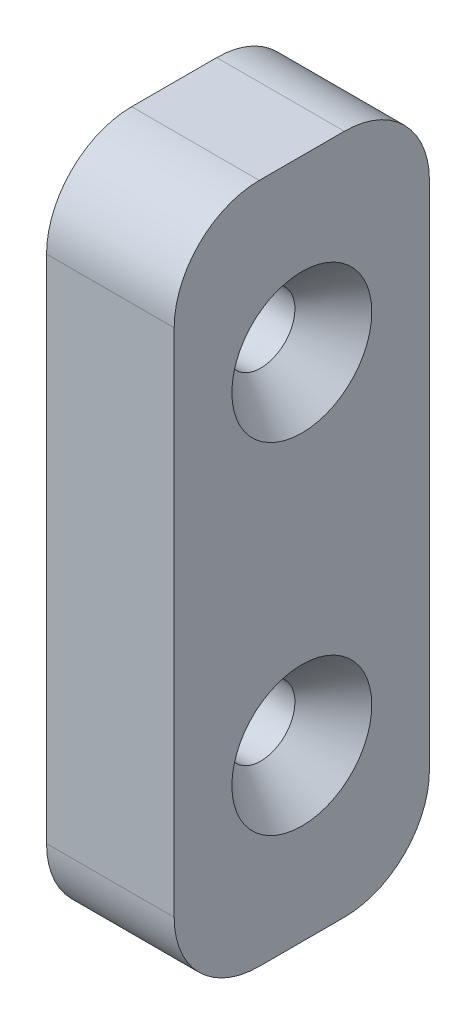
ISO-10303-21;
HEADER;
FILE_DESCRIPTION(('STEP AP214'),'2;1');
FILE_NAME('part.step','',(''),(''),'','','');
FILE_SCHEMA(('AUTOMOTIVE_DESIGN { 1 0 10303 214 1 1 1 1 }'));
ENDSEC;
DATA;
#1=APPLICATION_CONTEXT('core data for automotive mechanical design processes');
#2=APPLICATION_PROTOCOL_DEFINITION('international standard','automotive_design',2000,#1);
#3=PRODUCT_CONTEXT('',#1,'mechanical');
#4=PRODUCT('Part','Part','',(#3));
#5=PRODUCT_RELATED_PRODUCT_CATEGORY('part','',(#4));
#6=PRODUCT_DEFINITION_FORMATION('','',#4);
#7=PRODUCT_DEFINITION_CONTEXT('part definition',#1,'design');
#8=PRODUCT_DEFINITION('design','',#6,#7);
#9=PRODUCT_DEFINITION_SHAPE('','',#8);
#10=(LENGTH_UNIT() NAMED_UNIT(*) SI_UNIT(.MILLI.,.METRE.));
#11=(NAMED_UNIT(*) PLANE_ANGLE_UNIT() SI_UNIT($,.RADIAN.));
#12=(NAMED_UNIT(*) SI_UNIT($,.STERADIAN.) SOLID_ANGLE_UNIT());
#13=UNCERTAINTY_MEASURE_WITH_UNIT(LENGTH_MEASURE(1.E-05),#10,'distance_accuracy_value','');
#14=(GEOMETRIC_REPRESENTATION_CONTEXT(3) GLOBAL_UNCERTAINTY_ASSIGNED_CONTEXT((#13)) GLOBAL_UNIT_ASSIGNED_CONTEXT((#10,
#11,#12)) REPRESENTATION_CONTEXT('',''));
#15=CARTESIAN_POINT('',(0.,0.,0.));
#16=DIRECTION('',(0.,0.,1.));
#17=DIRECTION('',(1.,0.,0.));
#18=AXIS2_PLACEMENT_3D('',#15,#16,#17);
#19=CARTESIAN_POINT('',(333.375,-8.66629507760494,701.675));
#20=DIRECTION('',(-1.,0.,0.));
#21=DIRECTION('',(0.,-1.,0.));
#22=AXIS2_PLACEMENT_3D('',#19,#20,#21);
#23=CYLINDRICAL_SURFACE('',#22,2.5527);
#24=CARTESIAN_POINT('',(323.85,-8.66629507760494,701.675));
#25=DIRECTION('',(1.,0.,0.));
#26=DIRECTION('',(0.,1.,0.));
#27=AXIS2_PLACEMENT_3D('',#24,#25,#26);
#28=CIRCLE('',#27,2.5527);
#29=CARTESIAN_POINT('',(323.85,-6.11359507760494,701.675));
#30=VERTEX_POINT('',#29);
#31=EDGE_CURVE('E92',#30,#30,#28,.T.);
#32=ORIENTED_EDGE('',*,*,#31,.F.);
#33=EDGE_LOOP('',(#32));
#34=FACE_BOUND('',#33,.T.);
#35=CARTESIAN_POINT('',(330.306967457942,-8.66629507760494,701.675));
#36=DIRECTION('',(1.,0.,0.));
#37=DIRECTION('',(0.,1.,0.));
#38=AXIS2_PLACEMENT_3D('',#35,#36,#37);
#39=CIRCLE('',#38,2.5527);
#40=CARTESIAN_POINT('',(330.306967457942,-6.11359507760494,701.675));
#41=VERTEX_POINT('',#40);
#42=EDGE_CURVE('E177',#41,#41,#39,.T.);
#43=ORIENTED_EDGE('',*,*,#42,.T.);
#44=EDGE_LOOP('',(#43));
#45=FACE_BOUND('',#44,.T.);
#46=ADVANCED_FACE('F17',(#34,#45),#23,.F.);
#47=CARTESIAN_POINT('',(333.375,16.733704922395,701.675));
#48=DIRECTION('',(-1.,0.,0.));
#49=DIRECTION('',(0.,-1.,0.));
#50=AXIS2_PLACEMENT_3D('',#47,#48,#49);
#51=CYLINDRICAL_SURFACE('',#50,2.5527);
#52=CARTESIAN_POINT('',(323.85,16.733704922395,701.675));
#53=DIRECTION('',(1.,0.,0.));
#54=DIRECTION('',(0.,1.,0.));
#55=AXIS2_PLACEMENT_3D('',#52,#53,#54);
#56=CIRCLE('',#55,2.5527);
#57=CARTESIAN_POINT('',(323.85,19.2864049223951,701.675));
#58=VERTEX_POINT('',#57);
#59=EDGE_CURVE('E117',#58,#58,#56,.T.);
#60=ORIENTED_EDGE('',*,*,#59,.F.);
#61=EDGE_LOOP('',(#60));
#62=FACE_BOUND('',#61,.T.);
#63=CARTESIAN_POINT('',(330.306967457942,16.733704922395,701.675));
#64=DIRECTION('',(1.,0.,0.));
#65=DIRECTION('',(0.,1.,0.));
#66=AXIS2_PLACEMENT_3D('',#63,#64,#65);
#67=CIRCLE('',#66,2.5527);
#68=CARTESIAN_POINT('',(330.306967457942,19.2864049223951,701.675));
#69=VERTEX_POINT('',#68);
#70=EDGE_CURVE('E179',#69,#69,#67,.T.);
#71=ORIENTED_EDGE('',*,*,#70,.T.);
#72=EDGE_LOOP('',(#71));
#73=FACE_BOUND('',#72,.T.);
#74=ADVANCED_FACE('F221',(#62,#73),#51,.F.);
#75=CARTESIAN_POINT('',(333.375,4.03370492239503,711.2));
#76=DIRECTION('',(0.,0.,1.));
#77=DIRECTION('',(1.,0.,0.));
#78=AXIS2_PLACEMENT_3D('',#75,#76,#77);
#79=PLANE('',#78);
#80=DIRECTION('',(0.,1.,0.));
#81=VECTOR('',#80,1.);
#82=CARTESIAN_POINT('',(323.85,4.03370492239504,711.2));
#83=LINE('',#82,#81);
#84=CARTESIAN_POINT('',(323.85,-15.0162950776049,711.2));
#85=VERTEX_POINT('',#84);
#86=CARTESIAN_POINT('',(323.85,23.0837049223951,711.2));
#87=VERTEX_POINT('',#86);
#88=EDGE_CURVE('E167',#85,#87,#83,.T.);
#89=ORIENTED_EDGE('',*,*,#88,.F.);
#90=DIRECTION('',(-1.,0.,0.));
#91=VECTOR('',#90,1.);
#92=CARTESIAN_POINT('',(333.375,-15.0162950776049,711.2));
#93=LINE('',#92,#91);
#94=CARTESIAN_POINT('',(333.375,-15.0162950776049,711.2));
#95=VERTEX_POINT('',#94);
#96=EDGE_CURVE('E26',#85,#95,#93,.F.);
#97=ORIENTED_EDGE('',*,*,#96,.T.);
#98=DIRECTION('',(0.,1.,0.));
#99=VECTOR('',#98,1.);
#100=CARTESIAN_POINT('',(333.375,4.03370492239503,711.2));
#101=LINE('',#100,#99);
#102=CARTESIAN_POINT('',(333.375,23.0837049223951,711.2));
#103=VERTEX_POINT('',#102);
#104=EDGE_CURVE('E174',#95,#103,#101,.T.);
#105=ORIENTED_EDGE('',*,*,#104,.T.);
#106=DIRECTION('',(-1.,0.,0.));
#107=VECTOR('',#106,1.);
#108=CARTESIAN_POINT('',(333.375,23.0837049223951,711.2));
#109=LINE('',#108,#107);
#110=EDGE_CURVE('E125',#103,#87,#109,.T.);
#111=ORIENTED_EDGE('',*,*,#110,.T.);
#112=EDGE_LOOP('',(#89,#97,#105,#111));
#113=FACE_BOUND('',#112,.T.);
#114=ADVANCED_FACE('F199',(#113),#79,.T.);
#115=CARTESIAN_POINT('',(333.375,-21.3662950776049,534.9875));
#116=DIRECTION('',(0.,1.,0.));
#117=DIRECTION('',(-1.,0.,0.));
#118=AXIS2_PLACEMENT_3D('',#115,#116,#117);
#119=PLANE('',#118);
#120=DIRECTION('',(0.,0.,-1.));
#121=VECTOR('',#120,1.);
#122=CARTESIAN_POINT('',(333.375,-21.3662950776049,534.9875));
#123=LINE('',#122,#121);
#124=CARTESIAN_POINT('',(333.375,-21.3662950776049,704.85));
#125=VERTEX_POINT('',#124);
#126=CARTESIAN_POINT('',(333.375,-21.3662950776049,698.5));
#127=VERTEX_POINT('',#126);
#128=EDGE_CURVE('E164',#125,#127,#123,.T.);
#129=ORIENTED_EDGE('',*,*,#128,.F.);
#130=DIRECTION('',(-1.,0.,0.));
#131=VECTOR('',#130,1.);
#132=CARTESIAN_POINT('',(323.85,-21.3662950776049,704.85));
#133=LINE('',#132,#131);
#134=CARTESIAN_POINT('',(323.85,-21.3662950776049,704.85));
#135=VERTEX_POINT('',#134);
#136=EDGE_CURVE('E152',#125,#135,#133,.T.);
#137=ORIENTED_EDGE('',*,*,#136,.T.);
#138=DIRECTION('',(0.,0.,-1.));
#139=VECTOR('',#138,1.);
#140=CARTESIAN_POINT('',(323.85,-21.3662950776049,534.9875));
#141=LINE('',#140,#139);
#142=CARTESIAN_POINT('',(323.85,-21.3662950776049,698.5));
#143=VERTEX_POINT('',#142);
#144=EDGE_CURVE('E166',#135,#143,#141,.T.);
#145=ORIENTED_EDGE('',*,*,#144,.T.);
#146=DIRECTION('',(-1.,0.,0.));
#147=VECTOR('',#146,1.);
#148=CARTESIAN_POINT('',(333.375,-21.3662950776049,698.5));
#149=LINE('',#148,#147);
#150=EDGE_CURVE('E145',#143,#127,#149,.F.);
#151=ORIENTED_EDGE('',*,*,#150,.T.);
#152=EDGE_LOOP('',(#129,#137,#145,#151));
#153=FACE_BOUND('',#152,.T.);
#154=ADVANCED_FACE('F213',(#153),#119,.F.);
#155=CARTESIAN_POINT('',(333.375,4.03370492239503,692.15));
#156=DIRECTION('',(0.,0.,-1.));
#157=DIRECTION('',(-1.,0.,0.));
#158=AXIS2_PLACEMENT_3D('',#155,#156,#157);
#159=PLANE('',#158);
#160=DIRECTION('',(0.,-1.,0.));
#161=VECTOR('',#160,1.);
#162=CARTESIAN_POINT('',(333.375,4.03370492239503,692.15));
#163=LINE('',#162,#161);
#164=CARTESIAN_POINT('',(333.375,23.0837049223951,692.15));
#165=VERTEX_POINT('',#164);
#166=CARTESIAN_POINT('',(333.375,-15.0162950776049,692.15));
#167=VERTEX_POINT('',#166);
#168=EDGE_CURVE('E114',#165,#167,#163,.T.);
#169=ORIENTED_EDGE('',*,*,#168,.T.);
#170=DIRECTION('',(-1.,0.,0.));
#171=VECTOR('',#170,1.);
#172=CARTESIAN_POINT('',(323.85,-15.0162950776049,692.15));
#173=LINE('',#172,#171);
#174=CARTESIAN_POINT('',(323.85,-15.0162950776049,692.15));
#175=VERTEX_POINT('',#174);
#176=EDGE_CURVE('E137',#167,#175,#173,.T.);
#177=ORIENTED_EDGE('',*,*,#176,.T.);
#178=DIRECTION('',(0.,-1.,0.));
#179=VECTOR('',#178,1.);
#180=CARTESIAN_POINT('',(323.85,4.03370492239503,692.15));
#181=LINE('',#180,#179);
#182=CARTESIAN_POINT('',(323.85,23.0837049223951,692.15));
#183=VERTEX_POINT('',#182);
#184=EDGE_CURVE('E93',#183,#175,#181,.T.);
#185=ORIENTED_EDGE('',*,*,#184,.F.);
#186=DIRECTION('',(-1.,0.,0.));
#187=VECTOR('',#186,1.);
#188=CARTESIAN_POINT('',(333.375,23.0837049223951,692.15));
#189=LINE('',#188,#187);
#190=EDGE_CURVE('E101',#183,#165,#189,.F.);
#191=ORIENTED_EDGE('',*,*,#190,.T.);
#192=EDGE_LOOP('',(#169,#177,#185,#191));
#193=FACE_BOUND('',#192,.T.);
#194=ADVANCED_FACE('F207',(#193),#159,.T.);
#195=CARTESIAN_POINT('',(333.375,29.4337049223951,552.45));
#196=DIRECTION('',(0.,1.,0.));
#197=DIRECTION('',(-1.,0.,0.));
#198=AXIS2_PLACEMENT_3D('',#195,#196,#197);
#199=PLANE('',#198);
#200=DIRECTION('',(0.,0.,-1.));
#201=VECTOR('',#200,1.);
#202=CARTESIAN_POINT('',(323.85,29.4337049223951,552.45));
#203=LINE('',#202,#201);
#204=CARTESIAN_POINT('',(323.85,29.4337049223951,704.85));
#205=VERTEX_POINT('',#204);
#206=CARTESIAN_POINT('',(323.85,29.4337049223951,698.5));
#207=VERTEX_POINT('',#206);
#208=EDGE_CURVE('E79',#205,#207,#203,.T.);
#209=ORIENTED_EDGE('',*,*,#208,.F.);
#210=DIRECTION('',(-1.,0.,0.));
#211=VECTOR('',#210,1.);
#212=CARTESIAN_POINT('',(333.375,29.4337049223951,704.85));
#213=LINE('',#212,#211);
#214=CARTESIAN_POINT('',(333.375,29.4337049223951,704.85));
#215=VERTEX_POINT('',#214);
#216=EDGE_CURVE('E131',#205,#215,#213,.F.);
#217=ORIENTED_EDGE('',*,*,#216,.T.);
#218=DIRECTION('',(0.,0.,-1.));
#219=VECTOR('',#218,1.);
#220=CARTESIAN_POINT('',(333.375,29.4337049223951,552.45));
#221=LINE('',#220,#219);
#222=CARTESIAN_POINT('',(333.375,29.4337049223951,698.5));
#223=VERTEX_POINT('',#222);
#224=EDGE_CURVE('E106',#215,#223,#221,.T.);
#225=ORIENTED_EDGE('',*,*,#224,.T.);
#226=DIRECTION('',(-1.,0.,0.));
#227=VECTOR('',#226,1.);
#228=CARTESIAN_POINT('',(333.375,29.4337049223951,698.5));
#229=LINE('',#228,#227);
#230=EDGE_CURVE('E100',#223,#207,#229,.T.);
#231=ORIENTED_EDGE('',*,*,#230,.T.);
#232=EDGE_LOOP('',(#209,#217,#225,#231));
#233=FACE_BOUND('',#232,.T.);
#234=ADVANCED_FACE('F104',(#233),#199,.T.);
#235=CARTESIAN_POINT('',(333.375,-147.208147538801,552.45));
#236=DIRECTION('',(1.,0.,0.));
#237=DIRECTION('',(0.,1.,0.));
#238=AXIS2_PLACEMENT_3D('',#235,#236,#237);
#239=PLANE('',#238);
#240=CARTESIAN_POINT('',(333.375,16.733704922395,701.675));
#241=DIRECTION('',(-1.,0.,0.));
#242=DIRECTION('',(0.,-1.,0.));
#243=AXIS2_PLACEMENT_3D('',#240,#241,#242);
#244=CIRCLE('',#243,5.2197);
#245=CARTESIAN_POINT('',(333.375,11.514004922395,701.675));
#246=VERTEX_POINT('',#245);
#247=EDGE_CURVE('E188',#246,#246,#244,.T.);
#248=ORIENTED_EDGE('',*,*,#247,.T.);
#249=EDGE_LOOP('',(#248));
#250=FACE_BOUND('',#249,.T.);
#251=CARTESIAN_POINT('',(333.375,-8.66629507760494,701.675));
#252=DIRECTION('',(-1.,0.,0.));
#253=DIRECTION('',(0.,-1.,0.));
#254=AXIS2_PLACEMENT_3D('',#251,#252,#253);
#255=CIRCLE('',#254,5.2197);
#256=CARTESIAN_POINT('',(333.375,-13.8859950776049,701.675));
#257=VERTEX_POINT('',#256);
#258=EDGE_CURVE('E180',#257,#257,#255,.T.);
#259=ORIENTED_EDGE('',*,*,#258,.T.);
#260=EDGE_LOOP('',(#259));
#261=FACE_BOUND('',#260,.T.);
#262=ORIENTED_EDGE('',*,*,#104,.F.);
#263=CARTESIAN_POINT('',(333.375,-15.0162950776049,704.85));
#264=DIRECTION('',(1.,0.,0.));
#265=DIRECTION('',(0.,1.,0.));
#266=AXIS2_PLACEMENT_3D('',#263,#264,#265);
#267=CIRCLE('',#266,6.35);
#268=EDGE_CURVE('E11',#95,#125,#267,.T.);
#269=ORIENTED_EDGE('',*,*,#268,.T.);
#270=ORIENTED_EDGE('',*,*,#128,.T.);
#271=CARTESIAN_POINT('',(333.375,-15.0162950776049,698.5));
#272=DIRECTION('',(1.,0.,0.));
#273=DIRECTION('',(0.,1.,0.));
#274=AXIS2_PLACEMENT_3D('',#271,#272,#273);
#275=CIRCLE('',#274,6.35);
#276=EDGE_CURVE('E149',#127,#167,#275,.T.);
#277=ORIENTED_EDGE('',*,*,#276,.T.);
#278=ORIENTED_EDGE('',*,*,#168,.F.);
#279=CARTESIAN_POINT('',(333.375,23.0837049223951,698.5));
#280=DIRECTION('',(1.,0.,0.));
#281=DIRECTION('',(0.,1.,0.));
#282=AXIS2_PLACEMENT_3D('',#279,#280,#281);
#283=CIRCLE('',#282,6.35);
#284=EDGE_CURVE('E122',#165,#223,#283,.T.);
#285=ORIENTED_EDGE('',*,*,#284,.T.);
#286=ORIENTED_EDGE('',*,*,#224,.F.);
#287=CARTESIAN_POINT('',(333.375,23.0837049223951,704.85));
#288=DIRECTION('',(1.,0.,0.));
#289=DIRECTION('',(0.,1.,0.));
#290=AXIS2_PLACEMENT_3D('',#287,#288,#289);
#291=CIRCLE('',#290,6.35);
#292=EDGE_CURVE('E133',#215,#103,#291,.T.);
#293=ORIENTED_EDGE('',*,*,#292,.T.);
#294=EDGE_LOOP('',(#262,#269,#270,#277,#278,#285,#286,#293));
#295=FACE_BOUND('',#294,.T.);
#296=ADVANCED_FACE('F202',(#250,#261,#295),#239,.T.);
#297=CARTESIAN_POINT('',(323.85,-147.208147538801,552.45));
#298=DIRECTION('',(1.,0.,0.));
#299=DIRECTION('',(0.,1.,0.));
#300=AXIS2_PLACEMENT_3D('',#297,#298,#299);
#301=PLANE('',#300);
#302=ORIENTED_EDGE('',*,*,#144,.F.);
#303=CARTESIAN_POINT('',(323.85,-15.0162950776049,704.85));
#304=DIRECTION('',(1.,0.,0.));
#305=DIRECTION('',(0.,1.,0.));
#306=AXIS2_PLACEMENT_3D('',#303,#304,#305);
#307=CIRCLE('',#306,6.35);
#308=EDGE_CURVE('E40',#135,#85,#307,.F.);
#309=ORIENTED_EDGE('',*,*,#308,.T.);
#310=ORIENTED_EDGE('',*,*,#88,.T.);
#311=CARTESIAN_POINT('',(323.85,23.0837049223951,704.85));
#312=DIRECTION('',(1.,0.,0.));
#313=DIRECTION('',(0.,1.,0.));
#314=AXIS2_PLACEMENT_3D('',#311,#312,#313);
#315=CIRCLE('',#314,6.35);
#316=EDGE_CURVE('E87',#87,#205,#315,.F.);
#317=ORIENTED_EDGE('',*,*,#316,.T.);
#318=ORIENTED_EDGE('',*,*,#208,.T.);
#319=CARTESIAN_POINT('',(323.85,23.0837049223951,698.5));
#320=DIRECTION('',(1.,0.,0.));
#321=DIRECTION('',(0.,1.,0.));
#322=AXIS2_PLACEMENT_3D('',#319,#320,#321);
#323=CIRCLE('',#322,6.35);
#324=EDGE_CURVE('E84',#207,#183,#323,.F.);
#325=ORIENTED_EDGE('',*,*,#324,.T.);
#326=ORIENTED_EDGE('',*,*,#184,.T.);
#327=CARTESIAN_POINT('',(323.85,-15.0162950776049,698.5));
#328=DIRECTION('',(1.,0.,0.));
#329=DIRECTION('',(0.,1.,0.));
#330=AXIS2_PLACEMENT_3D('',#327,#328,#329);
#331=CIRCLE('',#330,6.35);
#332=EDGE_CURVE('E141',#175,#143,#331,.F.);
#333=ORIENTED_EDGE('',*,*,#332,.T.);
#334=EDGE_LOOP('',(#302,#309,#310,#317,#318,#325,#326,#333));
#335=FACE_BOUND('',#334,.T.);
#336=ORIENTED_EDGE('',*,*,#31,.T.);
#337=EDGE_LOOP('',(#336));
#338=FACE_BOUND('',#337,.T.);
#339=ORIENTED_EDGE('',*,*,#59,.T.);
#340=EDGE_LOOP('',(#339));
#341=FACE_BOUND('',#340,.T.);
#342=ADVANCED_FACE('F81',(#335,#338,#341),#301,.F.);
#343=CARTESIAN_POINT('',(333.375,-8.66629507760494,701.675));
#344=DIRECTION('',(1.,0.,0.));
#345=DIRECTION('',(0.,1.,0.));
#346=AXIS2_PLACEMENT_3D('',#343,#344,#345);
#347=CONICAL_SURFACE('',#346,5.2197,0.715584993317674);
#348=ORIENTED_EDGE('',*,*,#42,.F.);
#349=EDGE_LOOP('',(#348));
#350=FACE_BOUND('',#349,.T.);
#351=ORIENTED_EDGE('',*,*,#258,.F.);
#352=EDGE_LOOP('',(#351));
#353=FACE_BOUND('',#352,.T.);
#354=ADVANCED_FACE('F276',(#350,#353),#347,.F.);
#355=CARTESIAN_POINT('',(333.375,16.733704922395,701.675));
#356=DIRECTION('',(1.,0.,0.));
#357=DIRECTION('',(0.,1.,0.));
#358=AXIS2_PLACEMENT_3D('',#355,#356,#357);
#359=CONICAL_SURFACE('',#358,5.2197,0.715584993317674);
#360=ORIENTED_EDGE('',*,*,#70,.F.);
#361=EDGE_LOOP('',(#360));
#362=FACE_BOUND('',#361,.T.);
#363=ORIENTED_EDGE('',*,*,#247,.F.);
#364=EDGE_LOOP('',(#363));
#365=FACE_BOUND('',#364,.T.);
#366=ADVANCED_FACE('F241',(#362,#365),#359,.F.);
#367=CARTESIAN_POINT('',(333.375,23.0837049223951,698.5));
#368=DIRECTION('',(-1.,0.,0.));
#369=DIRECTION('',(0.,-1.,0.));
#370=AXIS2_PLACEMENT_3D('',#367,#368,#369);
#371=CYLINDRICAL_SURFACE('',#370,6.35);
#372=ORIENTED_EDGE('',*,*,#284,.F.);
#373=ORIENTED_EDGE('',*,*,#190,.F.);
#374=ORIENTED_EDGE('',*,*,#324,.F.);
#375=ORIENTED_EDGE('',*,*,#230,.F.);
#376=EDGE_LOOP('',(#372,#373,#374,#375));
#377=FACE_BOUND('',#376,.T.);
#378=ADVANCED_FACE('F99',(#377),#371,.T.);
#379=CARTESIAN_POINT('',(333.375,23.0837049223951,704.85));
#380=DIRECTION('',(-1.,0.,0.));
#381=DIRECTION('',(0.,-1.,0.));
#382=AXIS2_PLACEMENT_3D('',#379,#380,#381);
#383=CYLINDRICAL_SURFACE('',#382,6.35);
#384=ORIENTED_EDGE('',*,*,#292,.F.);
#385=ORIENTED_EDGE('',*,*,#216,.F.);
#386=ORIENTED_EDGE('',*,*,#316,.F.);
#387=ORIENTED_EDGE('',*,*,#110,.F.);
#388=EDGE_LOOP('',(#384,#385,#386,#387));
#389=FACE_BOUND('',#388,.T.);
#390=ADVANCED_FACE('F198',(#389),#383,.T.);
#391=CARTESIAN_POINT('',(333.375,-15.0162950776049,698.5));
#392=DIRECTION('',(1.,0.,0.));
#393=DIRECTION('',(0.,1.,0.));
#394=AXIS2_PLACEMENT_3D('',#391,#392,#393);
#395=CYLINDRICAL_SURFACE('',#394,6.35);
#396=ORIENTED_EDGE('',*,*,#276,.F.);
#397=ORIENTED_EDGE('',*,*,#150,.F.);
#398=ORIENTED_EDGE('',*,*,#332,.F.);
#399=ORIENTED_EDGE('',*,*,#176,.F.);
#400=EDGE_LOOP('',(#396,#397,#398,#399));
#401=FACE_BOUND('',#400,.T.);
#402=ADVANCED_FACE('F209',(#401),#395,.T.);
#403=CARTESIAN_POINT('',(333.375,-15.0162950776049,704.85));
#404=DIRECTION('',(1.,0.,0.));
#405=DIRECTION('',(0.,1.,0.));
#406=AXIS2_PLACEMENT_3D('',#403,#404,#405);
#407=CYLINDRICAL_SURFACE('',#406,6.35);
#408=ORIENTED_EDGE('',*,*,#268,.F.);
#409=ORIENTED_EDGE('',*,*,#96,.F.);
#410=ORIENTED_EDGE('',*,*,#308,.F.);
#411=ORIENTED_EDGE('',*,*,#136,.F.);
#412=EDGE_LOOP('',(#408,#409,#410,#411));
#413=FACE_BOUND('',#412,.T.);
#414=ADVANCED_FACE('F19',(#413),#407,.T.);
#415=CLOSED_SHELL('',(#46,#74,#114,#154,#194,#234,#296,#342,#354,#366,#378,#390,#402,#414));
#416=MANIFOLD_SOLID_BREP('B1',#415);
#417=ADVANCED_BREP_SHAPE_REPRESENTATION('',(#18,#416),#14);
#418=SHAPE_DEFINITION_REPRESENTATION(#9,#417);
ENDSEC;
END-ISO-10303-21;
